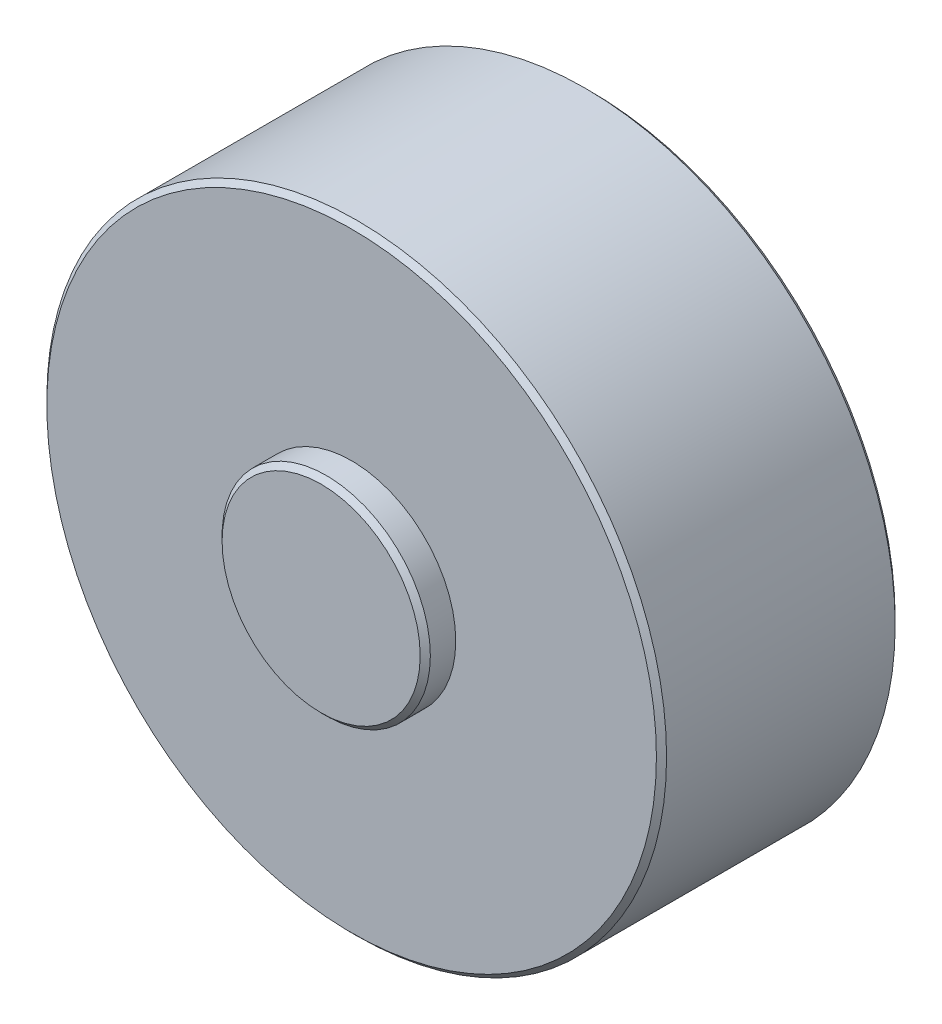
ISO-10303-21;
HEADER;
FILE_DESCRIPTION(('STEP AP214'),'2;1');
FILE_NAME('part.step','',(''),(''),'','','');
FILE_SCHEMA(('AUTOMOTIVE_DESIGN { 1 0 10303 214 1 1 1 1 }'));
ENDSEC;
DATA;
#1=APPLICATION_CONTEXT('core data for automotive mechanical design processes');
#2=APPLICATION_PROTOCOL_DEFINITION('international standard','automotive_design',2000,#1);
#3=PRODUCT_CONTEXT('',#1,'mechanical');
#4=PRODUCT('Part','Part','',(#3));
#5=PRODUCT_RELATED_PRODUCT_CATEGORY('part','',(#4));
#6=PRODUCT_DEFINITION_FORMATION('','',#4);
#7=PRODUCT_DEFINITION_CONTEXT('part definition',#1,'design');
#8=PRODUCT_DEFINITION('design','',#6,#7);
#9=PRODUCT_DEFINITION_SHAPE('','',#8);
#10=(LENGTH_UNIT() NAMED_UNIT(*) SI_UNIT(.MILLI.,.METRE.));
#11=(NAMED_UNIT(*) PLANE_ANGLE_UNIT() SI_UNIT($,.RADIAN.));
#12=(NAMED_UNIT(*) SI_UNIT($,.STERADIAN.) SOLID_ANGLE_UNIT());
#13=UNCERTAINTY_MEASURE_WITH_UNIT(LENGTH_MEASURE(1.E-05),#10,'distance_accuracy_value','');
#14=(GEOMETRIC_REPRESENTATION_CONTEXT(3) GLOBAL_UNCERTAINTY_ASSIGNED_CONTEXT((#13)) GLOBAL_UNIT_ASSIGNED_CONTEXT((#10,
#11,#12)) REPRESENTATION_CONTEXT('',''));
#15=CARTESIAN_POINT('',(0.,0.,0.));
#16=DIRECTION('',(0.,0.,1.));
#17=DIRECTION('',(1.,0.,0.));
#18=AXIS2_PLACEMENT_3D('',#15,#16,#17);
#19=CARTESIAN_POINT('',(0.,0.,47.));
#20=DIRECTION('',(0.,0.,1.));
#21=DIRECTION('',(1.,0.,0.));
#22=AXIS2_PLACEMENT_3D('',#19,#20,#21);
#23=PLANE('',#22);
#24=CARTESIAN_POINT('',(0.,0.,47.));
#25=DIRECTION('',(0.,0.,1.));
#26=DIRECTION('',(1.,0.,0.));
#27=AXIS2_PLACEMENT_3D('',#24,#25,#26);
#28=CIRCLE('',#27,59.9999999999999);
#29=CARTESIAN_POINT('',(59.9999999999999,0.,47.));
#30=VERTEX_POINT('',#29);
#31=EDGE_CURVE('E45',#30,#30,#28,.T.);
#32=ORIENTED_EDGE('',*,*,#31,.T.);
#33=EDGE_LOOP('',(#32));
#34=FACE_BOUND('',#33,.T.);
#35=CARTESIAN_POINT('',(0.,0.,47.));
#36=DIRECTION('',(0.,0.,1.));
#37=DIRECTION('',(1.,0.,0.));
#38=AXIS2_PLACEMENT_3D('',#35,#36,#37);
#39=CIRCLE('',#38,20.5);
#40=CARTESIAN_POINT('',(20.5,0.,47.));
#41=VERTEX_POINT('',#40);
#42=EDGE_CURVE('E60',#41,#41,#39,.T.);
#43=ORIENTED_EDGE('',*,*,#42,.F.);
#44=EDGE_LOOP('',(#43));
#45=FACE_BOUND('',#44,.T.);
#46=ADVANCED_FACE('F34',(#34,#45),#23,.T.);
#47=CARTESIAN_POINT('',(0.,0.,47.));
#48=DIRECTION('',(0.,0.,-1.));
#49=DIRECTION('',(-1.,0.,0.));
#50=AXIS2_PLACEMENT_3D('',#47,#48,#49);
#51=CYLINDRICAL_SURFACE('',#50,61.);
#52=CARTESIAN_POINT('',(0.,0.,1.00000000000001));
#53=DIRECTION('',(0.,0.,1.));
#54=DIRECTION('',(1.,0.,0.));
#55=AXIS2_PLACEMENT_3D('',#52,#53,#54);
#56=CIRCLE('',#55,61.);
#57=CARTESIAN_POINT('',(61.,0.,1.00000000000001));
#58=VERTEX_POINT('',#57);
#59=EDGE_CURVE('E54',#58,#58,#56,.T.);
#60=ORIENTED_EDGE('',*,*,#59,.T.);
#61=EDGE_LOOP('',(#60));
#62=FACE_BOUND('',#61,.T.);
#63=CARTESIAN_POINT('',(0.,0.,45.9999999999999));
#64=DIRECTION('',(0.,0.,1.));
#65=DIRECTION('',(1.,0.,0.));
#66=AXIS2_PLACEMENT_3D('',#63,#64,#65);
#67=CIRCLE('',#66,61.);
#68=CARTESIAN_POINT('',(61.,0.,45.9999999999999));
#69=VERTEX_POINT('',#68);
#70=EDGE_CURVE('E57',#69,#69,#67,.F.);
#71=ORIENTED_EDGE('',*,*,#70,.T.);
#72=EDGE_LOOP('',(#71));
#73=FACE_BOUND('',#72,.T.);
#74=ADVANCED_FACE('F67',(#62,#73),#51,.T.);
#75=CARTESIAN_POINT('',(0.,0.,0.));
#76=DIRECTION('',(0.,0.,1.));
#77=DIRECTION('',(1.,0.,0.));
#78=AXIS2_PLACEMENT_3D('',#75,#76,#77);
#79=PLANE('',#78);
#80=CARTESIAN_POINT('',(0.,0.,0.));
#81=DIRECTION('',(0.,0.,1.));
#82=DIRECTION('',(1.,0.,0.));
#83=AXIS2_PLACEMENT_3D('',#80,#81,#82);
#84=CIRCLE('',#83,60.);
#85=CARTESIAN_POINT('',(60.,0.,0.));
#86=VERTEX_POINT('',#85);
#87=EDGE_CURVE('E49',#86,#86,#84,.F.);
#88=ORIENTED_EDGE('',*,*,#87,.T.);
#89=EDGE_LOOP('',(#88));
#90=FACE_BOUND('',#89,.T.);
#91=ADVANCED_FACE('F73',(#90),#79,.F.);
#92=CARTESIAN_POINT('',(0.,0.,53.));
#93=DIRECTION('',(0.,0.,-1.));
#94=DIRECTION('',(-1.,0.,0.));
#95=AXIS2_PLACEMENT_3D('',#92,#93,#94);
#96=CYLINDRICAL_SURFACE('',#95,20.5);
#97=CARTESIAN_POINT('',(0.,0.,51.9999999999999));
#98=DIRECTION('',(0.,0.,1.));
#99=DIRECTION('',(1.,0.,0.));
#100=AXIS2_PLACEMENT_3D('',#97,#98,#99);
#101=CIRCLE('',#100,20.5);
#102=CARTESIAN_POINT('',(20.5,0.,51.9999999999999));
#103=VERTEX_POINT('',#102);
#104=EDGE_CURVE('E10',#103,#103,#101,.F.);
#105=ORIENTED_EDGE('',*,*,#104,.T.);
#106=EDGE_LOOP('',(#105));
#107=FACE_BOUND('',#106,.T.);
#108=ORIENTED_EDGE('',*,*,#42,.T.);
#109=EDGE_LOOP('',(#108));
#110=FACE_BOUND('',#109,.T.);
#111=ADVANCED_FACE('F64',(#107,#110),#96,.T.);
#112=CARTESIAN_POINT('',(0.,0.,53.));
#113=DIRECTION('',(0.,0.,1.));
#114=DIRECTION('',(1.,0.,0.));
#115=AXIS2_PLACEMENT_3D('',#112,#113,#114);
#116=PLANE('',#115);
#117=CARTESIAN_POINT('',(0.,0.,53.));
#118=DIRECTION('',(0.,0.,1.));
#119=DIRECTION('',(1.,0.,0.));
#120=AXIS2_PLACEMENT_3D('',#117,#118,#119);
#121=CIRCLE('',#120,19.5);
#122=CARTESIAN_POINT('',(19.5,0.,53.));
#123=VERTEX_POINT('',#122);
#124=EDGE_CURVE('E41',#123,#123,#121,.T.);
#125=ORIENTED_EDGE('',*,*,#124,.T.);
#126=EDGE_LOOP('',(#125));
#127=FACE_BOUND('',#126,.T.);
#128=ADVANCED_FACE('F85',(#127),#116,.T.);
#129=CARTESIAN_POINT('',(0.,0.,1.00000000000001));
#130=DIRECTION('',(0.,0.,1.));
#131=DIRECTION('',(1.,0.,0.));
#132=AXIS2_PLACEMENT_3D('',#129,#130,#131);
#133=CONICAL_SURFACE('',#132,61.,0.785398163397448);
#134=ORIENTED_EDGE('',*,*,#87,.F.);
#135=EDGE_LOOP('',(#134));
#136=FACE_BOUND('',#135,.T.);
#137=ORIENTED_EDGE('',*,*,#59,.F.);
#138=EDGE_LOOP('',(#137));
#139=FACE_BOUND('',#138,.T.);
#140=ADVANCED_FACE('F82',(#136,#139),#133,.T.);
#141=CARTESIAN_POINT('',(0.,0.,47.));
#142=DIRECTION('',(0.,0.,-1.));
#143=DIRECTION('',(-1.,0.,0.));
#144=AXIS2_PLACEMENT_3D('',#141,#142,#143);
#145=CONICAL_SURFACE('',#144,59.9999999999999,0.785398163397448);
#146=ORIENTED_EDGE('',*,*,#70,.F.);
#147=EDGE_LOOP('',(#146));
#148=FACE_BOUND('',#147,.T.);
#149=ORIENTED_EDGE('',*,*,#31,.F.);
#150=EDGE_LOOP('',(#149));
#151=FACE_BOUND('',#150,.T.);
#152=ADVANCED_FACE('F84',(#148,#151),#145,.T.);
#153=CARTESIAN_POINT('',(0.,0.,53.));
#154=DIRECTION('',(0.,0.,-1.));
#155=DIRECTION('',(-1.,0.,0.));
#156=AXIS2_PLACEMENT_3D('',#153,#154,#155);
#157=CONICAL_SURFACE('',#156,19.5,0.78539816339744);
#158=ORIENTED_EDGE('',*,*,#104,.F.);
#159=EDGE_LOOP('',(#158));
#160=FACE_BOUND('',#159,.T.);
#161=ORIENTED_EDGE('',*,*,#124,.F.);
#162=EDGE_LOOP('',(#161));
#163=FACE_BOUND('',#162,.T.);
#164=ADVANCED_FACE('F36',(#160,#163),#157,.T.);
#165=CLOSED_SHELL('',(#46,#74,#91,#111,#128,#140,#152,#164));
#166=MANIFOLD_SOLID_BREP('B2',#165);
#167=ADVANCED_BREP_SHAPE_REPRESENTATION('',(#18,#166),#14);
#168=SHAPE_DEFINITION_REPRESENTATION(#9,#167);
ENDSEC;
END-ISO-10303-21;
